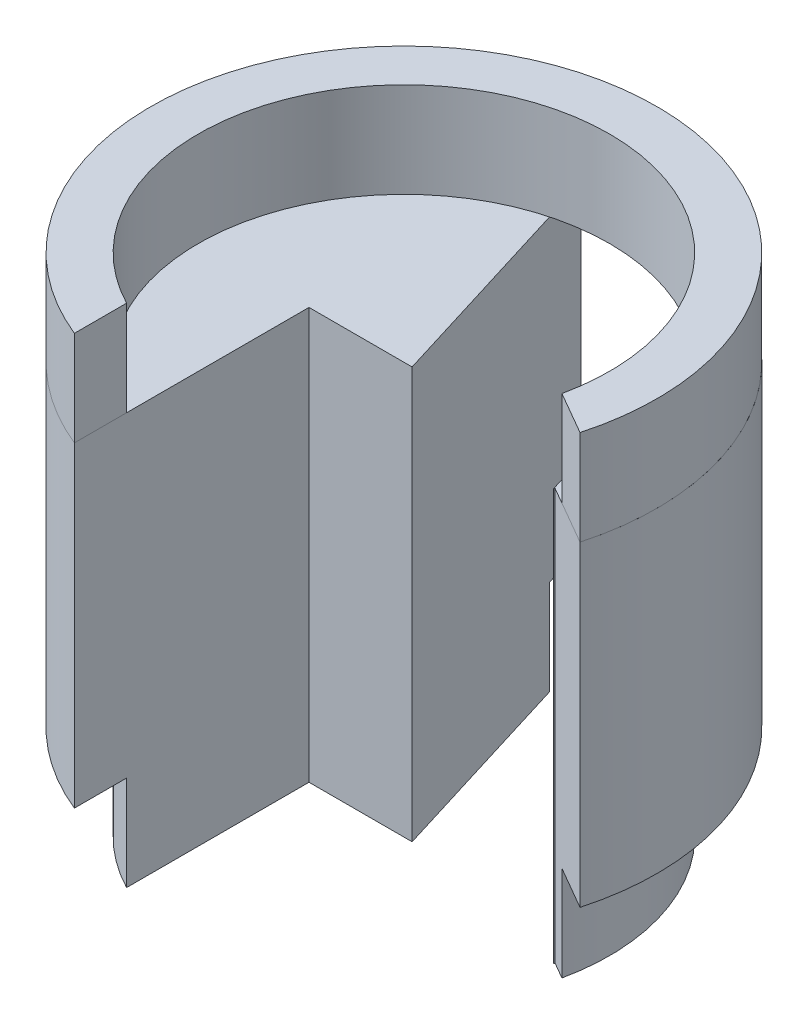
ISO-10303-21;
HEADER;
FILE_DESCRIPTION(('STEP AP214'),'2;1');
FILE_NAME('part.step','',(''),(''),'','','');
FILE_SCHEMA(('AUTOMOTIVE_DESIGN { 1 0 10303 214 1 1 1 1 }'));
ENDSEC;
DATA;
#1=APPLICATION_CONTEXT('core data for automotive mechanical design processes');
#2=APPLICATION_PROTOCOL_DEFINITION('international standard','automotive_design',2000,#1);
#3=PRODUCT_CONTEXT('',#1,'mechanical');
#4=PRODUCT('Part','Part','',(#3));
#5=PRODUCT_RELATED_PRODUCT_CATEGORY('part','',(#4));
#6=PRODUCT_DEFINITION_FORMATION('','',#4);
#7=PRODUCT_DEFINITION_CONTEXT('part definition',#1,'design');
#8=PRODUCT_DEFINITION('design','',#6,#7);
#9=PRODUCT_DEFINITION_SHAPE('','',#8);
#10=(LENGTH_UNIT() NAMED_UNIT(*) SI_UNIT(.MILLI.,.METRE.));
#11=(NAMED_UNIT(*) PLANE_ANGLE_UNIT() SI_UNIT($,.RADIAN.));
#12=(NAMED_UNIT(*) SI_UNIT($,.STERADIAN.) SOLID_ANGLE_UNIT());
#13=UNCERTAINTY_MEASURE_WITH_UNIT(LENGTH_MEASURE(1.E-05),#10,'distance_accuracy_value','');
#14=(GEOMETRIC_REPRESENTATION_CONTEXT(3) GLOBAL_UNCERTAINTY_ASSIGNED_CONTEXT((#13)) GLOBAL_UNIT_ASSIGNED_CONTEXT((#10,
#11,#12)) REPRESENTATION_CONTEXT('',''));
#15=CARTESIAN_POINT('',(0.,0.,0.));
#16=DIRECTION('',(0.,0.,1.));
#17=DIRECTION('',(1.,0.,0.));
#18=AXIS2_PLACEMENT_3D('',#15,#16,#17);
#19=CARTESIAN_POINT('',(0.,304.8,0.));
#20=DIRECTION('',(0.,-1.,0.));
#21=DIRECTION('',(0.,0.,-1.));
#22=AXIS2_PLACEMENT_3D('',#19,#20,#21);
#23=CYLINDRICAL_SURFACE('',#22,101.6);
#24=DIRECTION('',(0.,1.,0.));
#25=VECTOR('',#24,1.);
#26=CARTESIAN_POINT('',(-26.8844401083969,114.3,-97.9785021321413));
#27=LINE('',#26,#25);
#28=CARTESIAN_POINT('',(-26.8844401083969,177.8,-97.9785021321413));
#29=VERTEX_POINT('',#28);
#30=CARTESIAN_POINT('',(-26.8844401083969,304.8,-97.9785021321413));
#31=VERTEX_POINT('',#30);
#32=EDGE_CURVE('E66',#29,#31,#27,.T.);
#33=ORIENTED_EDGE('',*,*,#32,.F.);
#34=CARTESIAN_POINT('',(0.,177.8,0.));
#35=DIRECTION('',(0.,1.,0.));
#36=DIRECTION('',(0.,0.,1.));
#37=AXIS2_PLACEMENT_3D('',#34,#35,#36);
#38=CIRCLE('',#37,101.6);
#39=CARTESIAN_POINT('',(-38.1,177.8,94.1857207861149));
#40=VERTEX_POINT('',#39);
#41=EDGE_CURVE('E60',#29,#40,#38,.T.);
#42=ORIENTED_EDGE('',*,*,#41,.T.);
#43=DIRECTION('',(0.,1.,0.));
#44=VECTOR('',#43,1.);
#45=CARTESIAN_POINT('',(-38.1,114.3,94.1857207861149));
#46=LINE('',#45,#44);
#47=CARTESIAN_POINT('',(-38.1,304.8,94.1857207861149));
#48=VERTEX_POINT('',#47);
#49=EDGE_CURVE('E260',#40,#48,#46,.T.);
#50=ORIENTED_EDGE('',*,*,#49,.T.);
#51=CARTESIAN_POINT('',(0.,304.8,0.));
#52=DIRECTION('',(0.,1.,0.));
#53=DIRECTION('',(0.,0.,1.));
#54=AXIS2_PLACEMENT_3D('',#51,#52,#53);
#55=CIRCLE('',#54,101.6);
#56=EDGE_CURVE('E257',#31,#48,#55,.T.);
#57=ORIENTED_EDGE('',*,*,#56,.F.);
#58=EDGE_LOOP('',(#33,#42,#50,#57));
#59=FACE_BOUND('',#58,.T.);
#60=ADVANCED_FACE('F56',(#59),#23,.T.);
#61=CARTESIAN_POINT('',(0.,304.8,0.));
#62=DIRECTION('',(0.,1.,0.));
#63=DIRECTION('',(0.,0.,1.));
#64=AXIS2_PLACEMENT_3D('',#61,#62,#63);
#65=PLANE('',#64);
#66=DIRECTION('',(0.294299072182429,0.,0.955713375501547));
#67=VECTOR('',#66,1.);
#68=CARTESIAN_POINT('',(3.00205174876095,304.8,-0.924441435006951));
#69=LINE('',#68,#67);
#70=CARTESIAN_POINT('',(3.28672104771972,304.8,0.));
#71=VERTEX_POINT('',#70);
#72=EDGE_CURVE('E12',#31,#71,#69,.T.);
#73=ORIENTED_EDGE('',*,*,#72,.F.);
#74=ORIENTED_EDGE('',*,*,#56,.T.);
#75=DIRECTION('',(0.,0.,1.));
#76=VECTOR('',#75,1.);
#77=CARTESIAN_POINT('',(-38.1,304.8,0.));
#78=LINE('',#77,#76);
#79=CARTESIAN_POINT('',(-38.1,304.8,0.));
#80=VERTEX_POINT('',#79);
#81=EDGE_CURVE('E246',#80,#48,#78,.T.);
#82=ORIENTED_EDGE('',*,*,#81,.F.);
#83=DIRECTION('',(1.,0.,0.));
#84=VECTOR('',#83,1.);
#85=CARTESIAN_POINT('',(0.,304.8,0.));
#86=LINE('',#85,#84);
#87=EDGE_CURVE('E252',#80,#71,#86,.T.);
#88=ORIENTED_EDGE('',*,*,#87,.T.);
#89=EDGE_LOOP('',(#73,#74,#82,#88));
#90=FACE_BOUND('',#89,.T.);
#91=ADVANCED_FACE('F278',(#90),#65,.T.);
#92=CARTESIAN_POINT('',(-38.1,114.3,0.));
#93=DIRECTION('',(-1.,0.,0.));
#94=DIRECTION('',(0.,0.,1.));
#95=AXIS2_PLACEMENT_3D('',#92,#93,#94);
#96=PLANE('',#95);
#97=ORIENTED_EDGE('',*,*,#49,.F.);
#98=DIRECTION('',(0.,0.,-1.));
#99=VECTOR('',#98,1.);
#100=CARTESIAN_POINT('',(-38.1,177.8,0.));
#101=LINE('',#100,#99);
#102=CARTESIAN_POINT('',(-38.1,177.8,73.2317724761595));
#103=VERTEX_POINT('',#102);
#104=EDGE_CURVE('E256',#40,#103,#101,.T.);
#105=ORIENTED_EDGE('',*,*,#104,.T.);
#106=DIRECTION('',(0.,1.,0.));
#107=VECTOR('',#106,1.);
#108=CARTESIAN_POINT('',(-38.1,139.7,73.2317724761595));
#109=LINE('',#108,#107);
#110=CARTESIAN_POINT('',(-38.1,139.7,73.2317724761595));
#111=VERTEX_POINT('',#110);
#112=EDGE_CURVE('E82',#111,#103,#109,.T.);
#113=ORIENTED_EDGE('',*,*,#112,.F.);
#114=DIRECTION('',(0.,0.,-1.));
#115=VECTOR('',#114,1.);
#116=CARTESIAN_POINT('',(-38.1000000000001,139.7,-101.6));
#117=LINE('',#116,#115);
#118=CARTESIAN_POINT('',(-38.1,139.7,0.));
#119=VERTEX_POINT('',#118);
#120=EDGE_CURVE('E231',#111,#119,#117,.T.);
#121=ORIENTED_EDGE('',*,*,#120,.T.);
#122=DIRECTION('',(0.,1.,0.));
#123=VECTOR('',#122,1.);
#124=CARTESIAN_POINT('',(-38.1,114.3,0.));
#125=LINE('',#124,#123);
#126=EDGE_CURVE('E251',#119,#80,#125,.T.);
#127=ORIENTED_EDGE('',*,*,#126,.T.);
#128=ORIENTED_EDGE('',*,*,#81,.T.);
#129=EDGE_LOOP('',(#97,#105,#113,#121,#127,#128));
#130=FACE_BOUND('',#129,.T.);
#131=ADVANCED_FACE('F283',(#130),#96,.F.);
#132=CARTESIAN_POINT('',(0.,114.3,0.));
#133=DIRECTION('',(0.,0.,1.));
#134=DIRECTION('',(1.,0.,0.));
#135=AXIS2_PLACEMENT_3D('',#132,#133,#134);
#136=PLANE('',#135);
#137=ORIENTED_EDGE('',*,*,#126,.F.);
#138=DIRECTION('',(1.,0.,0.));
#139=VECTOR('',#138,1.);
#140=CARTESIAN_POINT('',(-101.6,139.7,0.));
#141=LINE('',#140,#139);
#142=CARTESIAN_POINT('',(3.28672104771972,139.7,0.));
#143=VERTEX_POINT('',#142);
#144=EDGE_CURVE('E235',#119,#143,#141,.T.);
#145=ORIENTED_EDGE('',*,*,#144,.T.);
#146=DIRECTION('',(0.,1.,0.));
#147=VECTOR('',#146,1.);
#148=CARTESIAN_POINT('',(3.28672104771972,114.3,0.));
#149=LINE('',#148,#147);
#150=EDGE_CURVE('E250',#143,#71,#149,.T.);
#151=ORIENTED_EDGE('',*,*,#150,.T.);
#152=ORIENTED_EDGE('',*,*,#87,.F.);
#153=EDGE_LOOP('',(#137,#145,#151,#152));
#154=FACE_BOUND('',#153,.T.);
#155=ADVANCED_FACE('F288',(#154),#136,.T.);
#156=CARTESIAN_POINT('',(3.00205174876095,114.3,-0.924441435006951));
#157=DIRECTION('',(-0.955713375501547,0.,0.294299072182429));
#158=DIRECTION('',(0.294299072182429,0.,0.955713375501547));
#159=AXIS2_PLACEMENT_3D('',#156,#157,#158);
#160=PLANE('',#159);
#161=ORIENTED_EDGE('',*,*,#150,.F.);
#162=DIRECTION('',(-0.294299072182429,0.,-0.955713375501547));
#163=VECTOR('',#162,1.);
#164=CARTESIAN_POINT('',(-34.374302613939,139.7,-122.301248799779));
#165=LINE('',#164,#163);
#166=CARTESIAN_POINT('',(-21.2747420301558,139.7,-79.7614433893364));
#167=VERTEX_POINT('',#166);
#168=EDGE_CURVE('E224',#143,#167,#165,.T.);
#169=ORIENTED_EDGE('',*,*,#168,.T.);
#170=DIRECTION('',(0.,1.,0.));
#171=VECTOR('',#170,1.);
#172=CARTESIAN_POINT('',(-21.2747420301558,139.7,-79.7614433893364));
#173=LINE('',#172,#171);
#174=CARTESIAN_POINT('',(-21.2747420301558,177.8,-79.7614433893364));
#175=VERTEX_POINT('',#174);
#176=EDGE_CURVE('E239',#167,#175,#173,.T.);
#177=ORIENTED_EDGE('',*,*,#176,.T.);
#178=DIRECTION('',(-0.294299072182429,0.,-0.955713375501547));
#179=VECTOR('',#178,1.);
#180=CARTESIAN_POINT('',(3.00205174876095,177.8,-0.924441435006951));
#181=LINE('',#180,#179);
#182=EDGE_CURVE('E265',#175,#29,#181,.T.);
#183=ORIENTED_EDGE('',*,*,#182,.T.);
#184=ORIENTED_EDGE('',*,*,#32,.T.);
#185=ORIENTED_EDGE('',*,*,#72,.T.);
#186=EDGE_LOOP('',(#161,#169,#177,#183,#184,#185));
#187=FACE_BOUND('',#186,.T.);
#188=ADVANCED_FACE('F291',(#187),#160,.F.);
#189=CARTESIAN_POINT('',(-101.6,177.8,-101.6));
#190=DIRECTION('',(0.,1.,0.));
#191=DIRECTION('',(0.,0.,1.));
#192=AXIS2_PLACEMENT_3D('',#189,#190,#191);
#193=PLANE('',#192);
#194=ORIENTED_EDGE('',*,*,#182,.F.);
#195=CARTESIAN_POINT('',(0.,177.8,0.));
#196=DIRECTION('',(0.,1.,0.));
#197=DIRECTION('',(0.,0.,1.));
#198=AXIS2_PLACEMENT_3D('',#195,#196,#197);
#199=CIRCLE('',#198,82.55);
#200=EDGE_CURVE('E172',#175,#103,#199,.T.);
#201=ORIENTED_EDGE('',*,*,#200,.T.);
#202=ORIENTED_EDGE('',*,*,#104,.F.);
#203=ORIENTED_EDGE('',*,*,#41,.F.);
#204=EDGE_LOOP('',(#194,#201,#202,#203));
#205=FACE_BOUND('',#204,.T.);
#206=ADVANCED_FACE('F58',(#205),#193,.F.);
#207=CARTESIAN_POINT('',(0.,139.7,0.));
#208=DIRECTION('',(0.,1.,0.));
#209=DIRECTION('',(0.,0.,1.));
#210=AXIS2_PLACEMENT_3D('',#207,#208,#209);
#211=CYLINDRICAL_SURFACE('',#210,82.55);
#212=ORIENTED_EDGE('',*,*,#200,.F.);
#213=ORIENTED_EDGE('',*,*,#176,.F.);
#214=CARTESIAN_POINT('',(0.,139.7,0.));
#215=DIRECTION('',(0.,1.,0.));
#216=DIRECTION('',(0.,0.,1.));
#217=AXIS2_PLACEMENT_3D('',#214,#215,#216);
#218=CIRCLE('',#217,82.55);
#219=EDGE_CURVE('E228',#167,#111,#218,.T.);
#220=ORIENTED_EDGE('',*,*,#219,.T.);
#221=ORIENTED_EDGE('',*,*,#112,.T.);
#222=EDGE_LOOP('',(#212,#213,#220,#221));
#223=FACE_BOUND('',#222,.T.);
#224=ADVANCED_FACE('F300',(#223),#211,.T.);
#225=CARTESIAN_POINT('',(0.,139.7,0.));
#226=DIRECTION('',(0.,1.,0.));
#227=DIRECTION('',(0.,0.,1.));
#228=AXIS2_PLACEMENT_3D('',#225,#226,#227);
#229=PLANE('',#228);
#230=DIRECTION('',(1.,0.,0.));
#231=VECTOR('',#230,1.);
#232=CARTESIAN_POINT('',(0.,139.7,-12.7));
#233=LINE('',#232,#231);
#234=CARTESIAN_POINT('',(-50.8,139.7,-12.7));
#235=VERTEX_POINT('',#234);
#236=CARTESIAN_POINT('',(-13.9125759780131,139.7,-12.7));
#237=VERTEX_POINT('',#236);
#238=EDGE_CURVE('E204',#235,#237,#233,.T.);
#239=ORIENTED_EDGE('',*,*,#238,.T.);
#240=DIRECTION('',(-0.294299072182429,0.,-0.955713375501547));
#241=VECTOR('',#240,1.);
#242=CARTESIAN_POINT('',(-9.13550812010869,139.7,2.8131567817099));
#243=LINE('',#242,#241);
#244=CARTESIAN_POINT('',(-29.4989010573643,139.7,-63.3153799357457));
#245=VERTEX_POINT('',#244);
#246=EDGE_CURVE('E211',#237,#245,#243,.T.);
#247=ORIENTED_EDGE('',*,*,#246,.T.);
#248=CARTESIAN_POINT('',(0.,139.7,0.));
#249=DIRECTION('',(0.,1.,0.));
#250=DIRECTION('',(0.,0.,1.));
#251=AXIS2_PLACEMENT_3D('',#248,#249,#250);
#252=CIRCLE('',#251,69.85);
#253=CARTESIAN_POINT('',(-50.8,139.7,47.9414486639693));
#254=VERTEX_POINT('',#253);
#255=EDGE_CURVE('E214',#245,#254,#252,.T.);
#256=ORIENTED_EDGE('',*,*,#255,.T.);
#257=DIRECTION('',(0.,0.,-1.));
#258=VECTOR('',#257,1.);
#259=CARTESIAN_POINT('',(-50.8,139.7,0.));
#260=LINE('',#259,#258);
#261=EDGE_CURVE('E74',#254,#235,#260,.T.);
#262=ORIENTED_EDGE('',*,*,#261,.T.);
#263=EDGE_LOOP('',(#239,#247,#256,#262));
#264=FACE_BOUND('',#263,.T.);
#265=ORIENTED_EDGE('',*,*,#168,.F.);
#266=ORIENTED_EDGE('',*,*,#144,.F.);
#267=ORIENTED_EDGE('',*,*,#120,.F.);
#268=ORIENTED_EDGE('',*,*,#219,.F.);
#269=EDGE_LOOP('',(#265,#266,#267,#268));
#270=FACE_BOUND('',#269,.T.);
#271=ADVANCED_FACE('F299',(#264,#270),#229,.F.);
#272=CARTESIAN_POINT('',(0.,304.8,0.));
#273=DIRECTION('',(0.,-1.,0.));
#274=DIRECTION('',(0.,0.,-1.));
#275=AXIS2_PLACEMENT_3D('',#272,#273,#274);
#276=CYLINDRICAL_SURFACE('',#275,88.9);
#277=DIRECTION('',(0.,-1.,0.));
#278=VECTOR('',#277,1.);
#279=CARTESIAN_POINT('',(-35.1470157652292,190.5,-81.6571936990167));
#280=LINE('',#279,#278);
#281=CARTESIAN_POINT('',(-35.1470157652292,190.5,-81.6571936990167));
#282=VERTEX_POINT('',#281);
#283=CARTESIAN_POINT('',(-35.1470157652292,292.1,-81.6571936990167));
#284=VERTEX_POINT('',#283);
#285=EDGE_CURVE('E150',#282,#284,#280,.F.);
#286=ORIENTED_EDGE('',*,*,#285,.T.);
#287=CARTESIAN_POINT('',(0.,292.1,0.));
#288=DIRECTION('',(0.,1.,0.));
#289=DIRECTION('',(0.,0.,1.));
#290=AXIS2_PLACEMENT_3D('',#287,#288,#289);
#291=CIRCLE('',#290,88.9);
#292=CARTESIAN_POINT('',(-50.8,292.1,72.955945611033));
#293=VERTEX_POINT('',#292);
#294=EDGE_CURVE('E155',#284,#293,#291,.T.);
#295=ORIENTED_EDGE('',*,*,#294,.T.);
#296=DIRECTION('',(0.,-1.,0.));
#297=VECTOR('',#296,1.);
#298=CARTESIAN_POINT('',(-50.8,190.5,72.955945611033));
#299=LINE('',#298,#297);
#300=CARTESIAN_POINT('',(-50.8,190.5,72.955945611033));
#301=VERTEX_POINT('',#300);
#302=EDGE_CURVE('E179',#301,#293,#299,.F.);
#303=ORIENTED_EDGE('',*,*,#302,.F.);
#304=CARTESIAN_POINT('',(0.,190.5,0.));
#305=DIRECTION('',(0.,1.,0.));
#306=DIRECTION('',(0.,0.,1.));
#307=AXIS2_PLACEMENT_3D('',#304,#305,#306);
#308=CIRCLE('',#307,88.9);
#309=EDGE_CURVE('E157',#282,#301,#308,.T.);
#310=ORIENTED_EDGE('',*,*,#309,.F.);
#311=EDGE_LOOP('',(#286,#295,#303,#310));
#312=FACE_BOUND('',#311,.T.);
#313=ADVANCED_FACE('F152',(#312),#276,.F.);
#314=CARTESIAN_POINT('',(0.,292.1,0.));
#315=DIRECTION('',(0.,1.,0.));
#316=DIRECTION('',(0.,0.,1.));
#317=AXIS2_PLACEMENT_3D('',#314,#315,#316);
#318=PLANE('',#317);
#319=DIRECTION('',(0.294299072182429,0.,0.955713375501547));
#320=VECTOR('',#319,1.);
#321=CARTESIAN_POINT('',(-9.1355081201087,292.1,2.8131567817099));
#322=LINE('',#321,#320);
#323=CARTESIAN_POINT('',(-13.9125759780131,292.1,-12.7));
#324=VERTEX_POINT('',#323);
#325=EDGE_CURVE('E161',#284,#324,#322,.T.);
#326=ORIENTED_EDGE('',*,*,#325,.T.);
#327=DIRECTION('',(1.,0.,0.));
#328=VECTOR('',#327,1.);
#329=CARTESIAN_POINT('',(0.,292.1,-12.7));
#330=LINE('',#329,#328);
#331=CARTESIAN_POINT('',(-50.8,292.1,-12.7));
#332=VERTEX_POINT('',#331);
#333=EDGE_CURVE('E178',#332,#324,#330,.T.);
#334=ORIENTED_EDGE('',*,*,#333,.F.);
#335=DIRECTION('',(0.,0.,1.));
#336=VECTOR('',#335,1.);
#337=CARTESIAN_POINT('',(-50.8,292.1,0.));
#338=LINE('',#337,#336);
#339=EDGE_CURVE('E176',#332,#293,#338,.T.);
#340=ORIENTED_EDGE('',*,*,#339,.T.);
#341=ORIENTED_EDGE('',*,*,#294,.F.);
#342=EDGE_LOOP('',(#326,#334,#340,#341));
#343=FACE_BOUND('',#342,.T.);
#344=ADVANCED_FACE('F174',(#343),#318,.F.);
#345=CARTESIAN_POINT('',(-50.8,114.3,0.));
#346=DIRECTION('',(-1.,0.,0.));
#347=DIRECTION('',(0.,0.,1.));
#348=AXIS2_PLACEMENT_3D('',#345,#346,#347);
#349=PLANE('',#348);
#350=ORIENTED_EDGE('',*,*,#302,.T.);
#351=ORIENTED_EDGE('',*,*,#339,.F.);
#352=DIRECTION('',(0.,1.,0.));
#353=VECTOR('',#352,1.);
#354=CARTESIAN_POINT('',(-50.8,114.3,-12.7));
#355=LINE('',#354,#353);
#356=EDGE_CURVE('E189',#235,#332,#355,.T.);
#357=ORIENTED_EDGE('',*,*,#356,.F.);
#358=ORIENTED_EDGE('',*,*,#261,.F.);
#359=DIRECTION('',(0.,1.,0.));
#360=VECTOR('',#359,1.);
#361=CARTESIAN_POINT('',(-50.8,139.7,47.9414486639693));
#362=LINE('',#361,#360);
#363=CARTESIAN_POINT('',(-50.8,190.5,47.9414486639693));
#364=VERTEX_POINT('',#363);
#365=EDGE_CURVE('E194',#254,#364,#362,.T.);
#366=ORIENTED_EDGE('',*,*,#365,.T.);
#367=DIRECTION('',(0.,0.,-1.));
#368=VECTOR('',#367,1.);
#369=CARTESIAN_POINT('',(-50.8,190.5,0.));
#370=LINE('',#369,#368);
#371=EDGE_CURVE('E183',#301,#364,#370,.T.);
#372=ORIENTED_EDGE('',*,*,#371,.F.);
#373=EDGE_LOOP('',(#350,#351,#357,#358,#366,#372));
#374=FACE_BOUND('',#373,.T.);
#375=ADVANCED_FACE('F384',(#374),#349,.T.);
#376=CARTESIAN_POINT('',(0.,114.3,-12.7));
#377=DIRECTION('',(0.,0.,1.));
#378=DIRECTION('',(1.,0.,0.));
#379=AXIS2_PLACEMENT_3D('',#376,#377,#378);
#380=PLANE('',#379);
#381=ORIENTED_EDGE('',*,*,#356,.T.);
#382=ORIENTED_EDGE('',*,*,#333,.T.);
#383=DIRECTION('',(0.,1.,0.));
#384=VECTOR('',#383,1.);
#385=CARTESIAN_POINT('',(-13.9125759780131,114.3,-12.7));
#386=LINE('',#385,#384);
#387=EDGE_CURVE('E167',#237,#324,#386,.T.);
#388=ORIENTED_EDGE('',*,*,#387,.F.);
#389=ORIENTED_EDGE('',*,*,#238,.F.);
#390=EDGE_LOOP('',(#381,#382,#388,#389));
#391=FACE_BOUND('',#390,.T.);
#392=ADVANCED_FACE('F392',(#391),#380,.F.);
#393=CARTESIAN_POINT('',(-9.13550812010869,114.3,2.8131567817099));
#394=DIRECTION('',(-0.955713375501547,0.,0.294299072182429));
#395=DIRECTION('',(0.294299072182429,0.,0.955713375501547));
#396=AXIS2_PLACEMENT_3D('',#393,#394,#395);
#397=PLANE('',#396);
#398=ORIENTED_EDGE('',*,*,#387,.T.);
#399=ORIENTED_EDGE('',*,*,#325,.F.);
#400=ORIENTED_EDGE('',*,*,#285,.F.);
#401=DIRECTION('',(-0.294299072182429,0.,-0.955713375501547));
#402=VECTOR('',#401,1.);
#403=CARTESIAN_POINT('',(-9.13550812010869,190.5,2.8131567817099));
#404=LINE('',#403,#402);
#405=CARTESIAN_POINT('',(-29.4989010573643,190.5,-63.3153799357457));
#406=VERTEX_POINT('',#405);
#407=EDGE_CURVE('E162',#406,#282,#404,.T.);
#408=ORIENTED_EDGE('',*,*,#407,.F.);
#409=DIRECTION('',(0.,1.,0.));
#410=VECTOR('',#409,1.);
#411=CARTESIAN_POINT('',(-29.4989010573643,139.7,-63.3153799357457));
#412=LINE('',#411,#410);
#413=EDGE_CURVE('E197',#245,#406,#412,.T.);
#414=ORIENTED_EDGE('',*,*,#413,.F.);
#415=ORIENTED_EDGE('',*,*,#246,.F.);
#416=EDGE_LOOP('',(#398,#399,#400,#408,#414,#415));
#417=FACE_BOUND('',#416,.T.);
#418=ADVANCED_FACE('F165',(#417),#397,.T.);
#419=CARTESIAN_POINT('',(-101.6,190.5,-101.6));
#420=DIRECTION('',(0.,1.,0.));
#421=DIRECTION('',(0.,0.,1.));
#422=AXIS2_PLACEMENT_3D('',#419,#420,#421);
#423=PLANE('',#422);
#424=ORIENTED_EDGE('',*,*,#407,.T.);
#425=ORIENTED_EDGE('',*,*,#309,.T.);
#426=ORIENTED_EDGE('',*,*,#371,.T.);
#427=CARTESIAN_POINT('',(0.,190.5,0.));
#428=DIRECTION('',(0.,1.,0.));
#429=DIRECTION('',(0.,0.,1.));
#430=AXIS2_PLACEMENT_3D('',#427,#428,#429);
#431=CIRCLE('',#430,69.85);
#432=EDGE_CURVE('E207',#406,#364,#431,.T.);
#433=ORIENTED_EDGE('',*,*,#432,.F.);
#434=EDGE_LOOP('',(#424,#425,#426,#433));
#435=FACE_BOUND('',#434,.T.);
#436=ADVANCED_FACE('F410',(#435),#423,.T.);
#437=CARTESIAN_POINT('',(0.,139.7,0.));
#438=DIRECTION('',(0.,1.,0.));
#439=DIRECTION('',(0.,0.,1.));
#440=AXIS2_PLACEMENT_3D('',#437,#438,#439);
#441=CYLINDRICAL_SURFACE('',#440,69.85);
#442=ORIENTED_EDGE('',*,*,#432,.T.);
#443=ORIENTED_EDGE('',*,*,#365,.F.);
#444=ORIENTED_EDGE('',*,*,#255,.F.);
#445=ORIENTED_EDGE('',*,*,#413,.T.);
#446=EDGE_LOOP('',(#442,#443,#444,#445));
#447=FACE_BOUND('',#446,.T.);
#448=ADVANCED_FACE('F419',(#447),#441,.F.);
#449=CLOSED_SHELL('',(#60,#91,#131,#155,#188,#206,#224,#271,#313,#344,#375,#392,#418,#436,#448));
#450=MANIFOLD_SOLID_BREP('B2',#449);
#451=CARTESIAN_POINT('',(0.,342.9,0.));
#452=DIRECTION('',(0.,1.,0.));
#453=DIRECTION('',(0.,0.,1.));
#454=AXIS2_PLACEMENT_3D('',#451,#452,#453);
#455=PLANE('',#454);
#456=CARTESIAN_POINT('',(0.,342.9,0.));
#457=DIRECTION('',(0.,1.,0.));
#458=DIRECTION('',(0.,0.,1.));
#459=AXIS2_PLACEMENT_3D('',#456,#457,#458);
#460=CIRCLE('',#459,82.55);
#461=CARTESIAN_POINT('',(80.7221057818705,342.9,17.2755358278843));
#462=VERTEX_POINT('',#461);
#463=CARTESIAN_POINT('',(-38.1,342.9,73.2317724761595));
#464=VERTEX_POINT('',#463);
#465=EDGE_CURVE('E514',#462,#464,#460,.T.);
#466=ORIENTED_EDGE('',*,*,#465,.F.);
#467=DIRECTION('',(0.866025403784435,0.,0.500000000000007));
#468=VECTOR('',#467,1.);
#469=CARTESIAN_POINT('',(74.2917267171491,342.9,13.562954743876));
#470=LINE('',#469,#468);
#471=CARTESIAN_POINT('',(97.8941899427417,342.9,27.1898432407104));
#472=VERTEX_POINT('',#471);
#473=EDGE_CURVE('E476',#462,#472,#470,.T.);
#474=ORIENTED_EDGE('',*,*,#473,.T.);
#475=CARTESIAN_POINT('',(0.,342.9,0.));
#476=DIRECTION('',(0.,1.,0.));
#477=DIRECTION('',(0.,0.,1.));
#478=AXIS2_PLACEMENT_3D('',#475,#476,#477);
#479=CIRCLE('',#478,101.6);
#480=CARTESIAN_POINT('',(-38.1,342.9,94.1857207861149));
#481=VERTEX_POINT('',#480);
#482=EDGE_CURVE('E512',#472,#481,#479,.T.);
#483=ORIENTED_EDGE('',*,*,#482,.T.);
#484=DIRECTION('',(0.,0.,1.));
#485=VECTOR('',#484,1.);
#486=CARTESIAN_POINT('',(-38.1,342.9,0.));
#487=LINE('',#486,#485);
#488=EDGE_CURVE('E507',#464,#481,#487,.T.);
#489=ORIENTED_EDGE('',*,*,#488,.F.);
#490=EDGE_LOOP('',(#466,#474,#483,#489));
#491=FACE_BOUND('',#490,.T.);
#492=ADVANCED_FACE('F461',(#491),#455,.T.);
#493=CARTESIAN_POINT('',(0.,304.8,0.));
#494=DIRECTION('',(0.,1.,0.));
#495=DIRECTION('',(0.,0.,1.));
#496=AXIS2_PLACEMENT_3D('',#493,#494,#495);
#497=PLANE('',#496);
#498=DIRECTION('',(0.866025403784435,0.,0.500000000000007));
#499=VECTOR('',#498,1.);
#500=CARTESIAN_POINT('',(12.7000000000001,304.8,-21.9970452561245));
#501=LINE('',#500,#499);
#502=CARTESIAN_POINT('',(80.7221057818705,304.8,17.2755358278843));
#503=VERTEX_POINT('',#502);
#504=CARTESIAN_POINT('',(97.8941899427417,304.8,27.1898432407104));
#505=VERTEX_POINT('',#504);
#506=EDGE_CURVE('E503',#503,#505,#501,.T.);
#507=ORIENTED_EDGE('',*,*,#506,.F.);
#508=CARTESIAN_POINT('',(0.,304.8,0.));
#509=DIRECTION('',(0.,1.,0.));
#510=DIRECTION('',(0.,0.,1.));
#511=AXIS2_PLACEMENT_3D('',#508,#509,#510);
#512=CIRCLE('',#511,82.55);
#513=CARTESIAN_POINT('',(-38.1,304.8,73.2317724761595));
#514=VERTEX_POINT('',#513);
#515=EDGE_CURVE('E483',#503,#514,#512,.T.);
#516=ORIENTED_EDGE('',*,*,#515,.T.);
#517=DIRECTION('',(0.,0.,1.));
#518=VECTOR('',#517,1.);
#519=CARTESIAN_POINT('',(-38.1,304.8,0.));
#520=LINE('',#519,#518);
#521=CARTESIAN_POINT('',(-38.1,304.8,94.1857207861149));
#522=VERTEX_POINT('',#521);
#523=EDGE_CURVE('E525',#514,#522,#520,.T.);
#524=ORIENTED_EDGE('',*,*,#523,.T.);
#525=CARTESIAN_POINT('',(0.,304.8,0.));
#526=DIRECTION('',(0.,1.,0.));
#527=DIRECTION('',(0.,0.,1.));
#528=AXIS2_PLACEMENT_3D('',#525,#526,#527);
#529=CIRCLE('',#528,101.6);
#530=EDGE_CURVE('E519',#505,#522,#529,.T.);
#531=ORIENTED_EDGE('',*,*,#530,.F.);
#532=EDGE_LOOP('',(#507,#516,#524,#531));
#533=FACE_BOUND('',#532,.T.);
#534=ADVANCED_FACE('F535',(#533),#497,.F.);
#535=CARTESIAN_POINT('',(0.,342.9,0.));
#536=DIRECTION('',(0.,-1.,0.));
#537=DIRECTION('',(0.,0.,-1.));
#538=AXIS2_PLACEMENT_3D('',#535,#536,#537);
#539=CYLINDRICAL_SURFACE('',#538,101.6);
#540=DIRECTION('',(0.,-1.,0.));
#541=VECTOR('',#540,1.);
#542=CARTESIAN_POINT('',(97.8941899427417,342.9,27.1898432407104));
#543=LINE('',#542,#541);
#544=EDGE_CURVE('E501',#505,#472,#543,.F.);
#545=ORIENTED_EDGE('',*,*,#544,.F.);
#546=ORIENTED_EDGE('',*,*,#530,.T.);
#547=DIRECTION('',(0.,1.,0.));
#548=VECTOR('',#547,1.);
#549=CARTESIAN_POINT('',(-38.1,114.3,94.1857207861149));
#550=LINE('',#549,#548);
#551=EDGE_CURVE('E518',#522,#481,#550,.T.);
#552=ORIENTED_EDGE('',*,*,#551,.T.);
#553=ORIENTED_EDGE('',*,*,#482,.F.);
#554=EDGE_LOOP('',(#545,#546,#552,#553));
#555=FACE_BOUND('',#554,.T.);
#556=ADVANCED_FACE('F463',(#555),#539,.T.);
#557=CARTESIAN_POINT('',(0.,342.9,0.));
#558=DIRECTION('',(0.,-1.,0.));
#559=DIRECTION('',(0.,0.,-1.));
#560=AXIS2_PLACEMENT_3D('',#557,#558,#559);
#561=CYLINDRICAL_SURFACE('',#560,82.55);
#562=ORIENTED_EDGE('',*,*,#515,.F.);
#563=DIRECTION('',(0.,-1.,0.));
#564=VECTOR('',#563,1.);
#565=CARTESIAN_POINT('',(80.7221057818705,342.9,17.2755358278843));
#566=LINE('',#565,#564);
#567=EDGE_CURVE('E54',#503,#462,#566,.F.);
#568=ORIENTED_EDGE('',*,*,#567,.T.);
#569=ORIENTED_EDGE('',*,*,#465,.T.);
#570=DIRECTION('',(0.,-1.,0.));
#571=VECTOR('',#570,1.);
#572=CARTESIAN_POINT('',(-38.1,342.9,73.2317724761595));
#573=LINE('',#572,#571);
#574=EDGE_CURVE('E469',#514,#464,#573,.F.);
#575=ORIENTED_EDGE('',*,*,#574,.F.);
#576=EDGE_LOOP('',(#562,#568,#569,#575));
#577=FACE_BOUND('',#576,.T.);
#578=ADVANCED_FACE('F534',(#577),#561,.F.);
#579=CARTESIAN_POINT('',(-38.1,114.3,0.));
#580=DIRECTION('',(-1.,0.,0.));
#581=DIRECTION('',(0.,0.,1.));
#582=AXIS2_PLACEMENT_3D('',#579,#580,#581);
#583=PLANE('',#582);
#584=ORIENTED_EDGE('',*,*,#574,.T.);
#585=ORIENTED_EDGE('',*,*,#488,.T.);
#586=ORIENTED_EDGE('',*,*,#551,.F.);
#587=ORIENTED_EDGE('',*,*,#523,.F.);
#588=EDGE_LOOP('',(#584,#585,#586,#587));
#589=FACE_BOUND('',#588,.T.);
#590=ADVANCED_FACE('F531',(#589),#583,.F.);
#591=CARTESIAN_POINT('',(74.2917267171491,-22.6727960055398,13.562954743876));
#592=DIRECTION('',(-0.500000000000007,0.,0.866025403784434));
#593=DIRECTION('',(0.866025403784435,0.,0.500000000000007));
#594=AXIS2_PLACEMENT_3D('',#591,#592,#593);
#595=PLANE('',#594);
#596=ORIENTED_EDGE('',*,*,#544,.T.);
#597=ORIENTED_EDGE('',*,*,#473,.F.);
#598=ORIENTED_EDGE('',*,*,#567,.F.);
#599=ORIENTED_EDGE('',*,*,#506,.T.);
#600=EDGE_LOOP('',(#596,#597,#598,#599));
#601=FACE_BOUND('',#600,.T.);
#602=ADVANCED_FACE('F502',(#601),#595,.T.);
#603=CLOSED_SHELL('',(#492,#534,#556,#578,#590,#602));
#604=MANIFOLD_SOLID_BREP('B6',#603);
#605=CARTESIAN_POINT('',(0.,304.8,0.));
#606=DIRECTION('',(0.,1.,0.));
#607=DIRECTION('',(0.,0.,1.));
#608=AXIS2_PLACEMENT_3D('',#605,#606,#607);
#609=PLANE('',#608);
#610=DIRECTION('',(0.500000000000007,0.,-0.866025403784435));
#611=VECTOR('',#610,1.);
#612=CARTESIAN_POINT('',(61.591726717149,304.8,35.5600000000005));
#613=LINE('',#612,#611);
#614=CARTESIAN_POINT('',(74.040017302983,304.8,13.998928237955));
#615=VERTEX_POINT('',#614);
#616=CARTESIAN_POINT('',(74.2917267171491,304.8,13.562954743876));
#617=VERTEX_POINT('',#616);
#618=EDGE_CURVE('E675',#615,#617,#613,.T.);
#619=ORIENTED_EDGE('',*,*,#618,.T.);
#620=DIRECTION('',(0.866025403784435,0.,0.500000000000007));
#621=VECTOR('',#620,1.);
#622=CARTESIAN_POINT('',(12.7000000000001,304.8,-21.9970452561245));
#623=LINE('',#622,#621);
#624=CARTESIAN_POINT('',(97.8941899427417,304.8,27.1898432407104));
#625=VERTEX_POINT('',#624);
#626=EDGE_CURVE('E459',#617,#625,#623,.T.);
#627=ORIENTED_EDGE('',*,*,#626,.T.);
#628=CARTESIAN_POINT('',(0.,304.8,0.));
#629=DIRECTION('',(0.,1.,0.));
#630=DIRECTION('',(0.,0.,1.));
#631=AXIS2_PLACEMENT_3D('',#628,#629,#630);
#632=CIRCLE('',#631,101.6);
#633=CARTESIAN_POINT('',(41.1197496711301,304.8,-92.9070836211298));
#634=VERTEX_POINT('',#633);
#635=EDGE_CURVE('E684',#625,#634,#632,.T.);
#636=ORIENTED_EDGE('',*,*,#635,.T.);
#637=DIRECTION('',(0.29429907218243,0.,0.955713375501547));
#638=VECTOR('',#637,1.);
#639=CARTESIAN_POINT('',(63.6898510931092,304.8,-19.6124325185913));
#640=LINE('',#639,#638);
#641=EDGE_CURVE('E680',#634,#615,#640,.T.);
#642=ORIENTED_EDGE('',*,*,#641,.T.);
#643=EDGE_LOOP('',(#619,#627,#636,#642));
#644=FACE_BOUND('',#643,.T.);
#645=ADVANCED_FACE('F585',(#644),#609,.T.);
#646=CARTESIAN_POINT('',(48.8917267171489,-22.6727960055398,57.557045256125));
#647=DIRECTION('',(0.866025403784434,0.,0.500000000000007));
#648=DIRECTION('',(0.500000000000007,0.,-0.866025403784435));
#649=AXIS2_PLACEMENT_3D('',#646,#647,#648);
#650=PLANE('',#649);
#651=DIRECTION('',(0.,1.,0.));
#652=VECTOR('',#651,1.);
#653=CARTESIAN_POINT('',(74.040017302983,114.3,13.998928237955));
#654=LINE('',#653,#652);
#655=CARTESIAN_POINT('',(74.0400173029829,139.7,13.9989282379551));
#656=VERTEX_POINT('',#655);
#657=EDGE_CURVE('E593',#656,#615,#654,.T.);
#658=ORIENTED_EDGE('',*,*,#657,.F.);
#659=DIRECTION('',(0.499999999999989,0.,-0.866025403784445));
#660=VECTOR('',#659,1.);
#661=CARTESIAN_POINT('',(80.1858172294002,139.7,3.35409051224708));
#662=LINE('',#661,#660);
#663=CARTESIAN_POINT('',(74.2917267171491,139.7,13.562954743876));
#664=VERTEX_POINT('',#663);
#665=EDGE_CURVE('E647',#656,#664,#662,.T.);
#666=ORIENTED_EDGE('',*,*,#665,.T.);
#667=DIRECTION('',(0.,1.,0.));
#668=VECTOR('',#667,1.);
#669=CARTESIAN_POINT('',(74.2917267171491,-22.6727960055398,13.562954743876));
#670=LINE('',#669,#668);
#671=EDGE_CURVE('E661',#664,#617,#670,.T.);
#672=ORIENTED_EDGE('',*,*,#671,.T.);
#673=ORIENTED_EDGE('',*,*,#618,.F.);
#674=EDGE_LOOP('',(#658,#666,#672,#673));
#675=FACE_BOUND('',#674,.T.);
#676=ADVANCED_FACE('F691',(#675),#650,.T.);
#677=CARTESIAN_POINT('',(74.2917267171491,-22.6727960055398,13.562954743876));
#678=DIRECTION('',(-0.500000000000007,0.,0.866025403784434));
#679=DIRECTION('',(0.866025403784435,0.,0.500000000000007));
#680=AXIS2_PLACEMENT_3D('',#677,#678,#679);
#681=PLANE('',#680);
#682=DIRECTION('',(-0.866025403784435,0.,-0.500000000000007));
#683=VECTOR('',#682,1.);
#684=CARTESIAN_POINT('',(74.2917267171491,177.8,13.562954743876));
#685=LINE('',#684,#683);
#686=CARTESIAN_POINT('',(97.8941899427417,177.8,27.1898432407104));
#687=VERTEX_POINT('',#686);
#688=CARTESIAN_POINT('',(80.7221057818705,177.8,17.2755358278843));
#689=VERTEX_POINT('',#688);
#690=EDGE_CURVE('E667',#687,#689,#685,.T.);
#691=ORIENTED_EDGE('',*,*,#690,.F.);
#692=DIRECTION('',(0.,-1.,0.));
#693=VECTOR('',#692,1.);
#694=CARTESIAN_POINT('',(97.8941899427417,304.8,27.1898432407104));
#695=LINE('',#694,#693);
#696=EDGE_CURVE('E678',#687,#625,#695,.F.);
#697=ORIENTED_EDGE('',*,*,#696,.T.);
#698=ORIENTED_EDGE('',*,*,#626,.F.);
#699=ORIENTED_EDGE('',*,*,#671,.F.);
#700=DIRECTION('',(0.866025403784435,0.,0.500000000000007));
#701=VECTOR('',#700,1.);
#702=CARTESIAN_POINT('',(-107.494090512249,139.7,-91.3911357683751));
#703=LINE('',#702,#701);
#704=CARTESIAN_POINT('',(80.7221057818705,139.7,17.2755358278843));
#705=VERTEX_POINT('',#704);
#706=EDGE_CURVE('E654',#664,#705,#703,.T.);
#707=ORIENTED_EDGE('',*,*,#706,.T.);
#708=DIRECTION('',(0.,1.,0.));
#709=VECTOR('',#708,1.);
#710=CARTESIAN_POINT('',(80.7221057818705,139.7,17.2755358278843));
#711=LINE('',#710,#709);
#712=EDGE_CURVE('E638',#705,#689,#711,.T.);
#713=ORIENTED_EDGE('',*,*,#712,.T.);
#714=EDGE_LOOP('',(#691,#697,#698,#699,#707,#713));
#715=FACE_BOUND('',#714,.T.);
#716=ADVANCED_FACE('F659',(#715),#681,.T.);
#717=CARTESIAN_POINT('',(63.6898510931092,114.3,-19.6124325185913));
#718=DIRECTION('',(-0.955713375501547,0.,0.29429907218243));
#719=DIRECTION('',(0.29429907218243,0.,0.955713375501547));
#720=AXIS2_PLACEMENT_3D('',#717,#718,#719);
#721=PLANE('',#720);
#722=DIRECTION('',(-0.29429907218243,0.,-0.955713375501547));
#723=VECTOR('',#722,1.);
#724=CARTESIAN_POINT('',(63.6898510931092,177.8,-19.6124325185913));
#725=LINE('',#724,#723);
#726=CARTESIAN_POINT('',(49.3521455983476,177.8,-66.1730173472503));
#727=VERTEX_POINT('',#726);
#728=CARTESIAN_POINT('',(41.1197496711301,177.8,-92.9070836211298));
#729=VERTEX_POINT('',#728);
#730=EDGE_CURVE('E670',#727,#729,#725,.T.);
#731=ORIENTED_EDGE('',*,*,#730,.F.);
#732=DIRECTION('',(0.,1.,0.));
#733=VECTOR('',#732,1.);
#734=CARTESIAN_POINT('',(49.3521455983476,139.7,-66.1730173472503));
#735=LINE('',#734,#733);
#736=CARTESIAN_POINT('',(49.3521455983476,139.7,-66.1730173472503));
#737=VERTEX_POINT('',#736);
#738=EDGE_CURVE('E600',#737,#727,#735,.T.);
#739=ORIENTED_EDGE('',*,*,#738,.F.);
#740=DIRECTION('',(0.29429907218243,0.,0.955713375501547));
#741=VECTOR('',#740,1.);
#742=CARTESIAN_POINT('',(26.3134967304091,139.7,-140.989239883364));
#743=LINE('',#742,#741);
#744=EDGE_CURVE('E657',#737,#656,#743,.T.);
#745=ORIENTED_EDGE('',*,*,#744,.T.);
#746=ORIENTED_EDGE('',*,*,#657,.T.);
#747=ORIENTED_EDGE('',*,*,#641,.F.);
#748=DIRECTION('',(0.,1.,0.));
#749=VECTOR('',#748,1.);
#750=CARTESIAN_POINT('',(41.1197496711301,114.3,-92.9070836211298));
#751=LINE('',#750,#749);
#752=EDGE_CURVE('E608',#729,#634,#751,.T.);
#753=ORIENTED_EDGE('',*,*,#752,.F.);
#754=EDGE_LOOP('',(#731,#739,#745,#746,#747,#753));
#755=FACE_BOUND('',#754,.T.);
#756=ADVANCED_FACE('F689',(#755),#721,.T.);
#757=CARTESIAN_POINT('',(0.,304.8,0.));
#758=DIRECTION('',(0.,-1.,0.));
#759=DIRECTION('',(0.,0.,-1.));
#760=AXIS2_PLACEMENT_3D('',#757,#758,#759);
#761=CYLINDRICAL_SURFACE('',#760,101.6);
#762=ORIENTED_EDGE('',*,*,#696,.F.);
#763=CARTESIAN_POINT('',(0.,177.8,0.));
#764=DIRECTION('',(0.,1.,0.));
#765=DIRECTION('',(0.,0.,1.));
#766=AXIS2_PLACEMENT_3D('',#763,#764,#765);
#767=CIRCLE('',#766,101.6);
#768=EDGE_CURVE('E672',#687,#729,#767,.T.);
#769=ORIENTED_EDGE('',*,*,#768,.T.);
#770=ORIENTED_EDGE('',*,*,#752,.T.);
#771=ORIENTED_EDGE('',*,*,#635,.F.);
#772=EDGE_LOOP('',(#762,#769,#770,#771));
#773=FACE_BOUND('',#772,.T.);
#774=ADVANCED_FACE('F587',(#773),#761,.T.);
#775=CARTESIAN_POINT('',(-101.6,177.8,-101.6));
#776=DIRECTION('',(0.,1.,0.));
#777=DIRECTION('',(0.,0.,1.));
#778=AXIS2_PLACEMENT_3D('',#775,#776,#777);
#779=PLANE('',#778);
#780=ORIENTED_EDGE('',*,*,#690,.T.);
#781=CARTESIAN_POINT('',(0.,177.8,0.));
#782=DIRECTION('',(0.,1.,0.));
#783=DIRECTION('',(0.,0.,1.));
#784=AXIS2_PLACEMENT_3D('',#781,#782,#783);
#785=CIRCLE('',#784,82.55);
#786=EDGE_CURVE('E642',#689,#727,#785,.T.);
#787=ORIENTED_EDGE('',*,*,#786,.T.);
#788=ORIENTED_EDGE('',*,*,#730,.T.);
#789=ORIENTED_EDGE('',*,*,#768,.F.);
#790=EDGE_LOOP('',(#780,#787,#788,#789));
#791=FACE_BOUND('',#790,.T.);
#792=ADVANCED_FACE('F695',(#791),#779,.F.);
#793=CARTESIAN_POINT('',(0.,139.7,0.));
#794=DIRECTION('',(0.,1.,0.));
#795=DIRECTION('',(0.,0.,1.));
#796=AXIS2_PLACEMENT_3D('',#793,#794,#795);
#797=CYLINDRICAL_SURFACE('',#796,82.55);
#798=ORIENTED_EDGE('',*,*,#786,.F.);
#799=ORIENTED_EDGE('',*,*,#712,.F.);
#800=CARTESIAN_POINT('',(0.,139.7,0.));
#801=DIRECTION('',(0.,1.,0.));
#802=DIRECTION('',(0.,0.,1.));
#803=AXIS2_PLACEMENT_3D('',#800,#801,#802);
#804=CIRCLE('',#803,82.55);
#805=EDGE_CURVE('E641',#705,#737,#804,.T.);
#806=ORIENTED_EDGE('',*,*,#805,.T.);
#807=ORIENTED_EDGE('',*,*,#738,.T.);
#808=EDGE_LOOP('',(#798,#799,#806,#807));
#809=FACE_BOUND('',#808,.T.);
#810=ADVANCED_FACE('F640',(#809),#797,.T.);
#811=CARTESIAN_POINT('',(0.,139.7,0.));
#812=DIRECTION('',(0.,1.,0.));
#813=DIRECTION('',(0.,0.,1.));
#814=AXIS2_PLACEMENT_3D('',#811,#812,#813);
#815=PLANE('',#814);
#816=ORIENTED_EDGE('',*,*,#706,.F.);
#817=ORIENTED_EDGE('',*,*,#665,.F.);
#818=ORIENTED_EDGE('',*,*,#744,.F.);
#819=ORIENTED_EDGE('',*,*,#805,.F.);
#820=EDGE_LOOP('',(#816,#817,#818,#819));
#821=FACE_BOUND('',#820,.T.);
#822=ADVANCED_FACE('F652',(#821),#815,.F.);
#823=CLOSED_SHELL('',(#645,#676,#716,#756,#774,#792,#810,#822));
#824=MANIFOLD_SOLID_BREP('B48',#823);
#825=ADVANCED_BREP_SHAPE_REPRESENTATION('',(#18,#450,#604,#824),#14);
#826=SHAPE_DEFINITION_REPRESENTATION(#9,#825);
ENDSEC;
END-ISO-10303-21;
